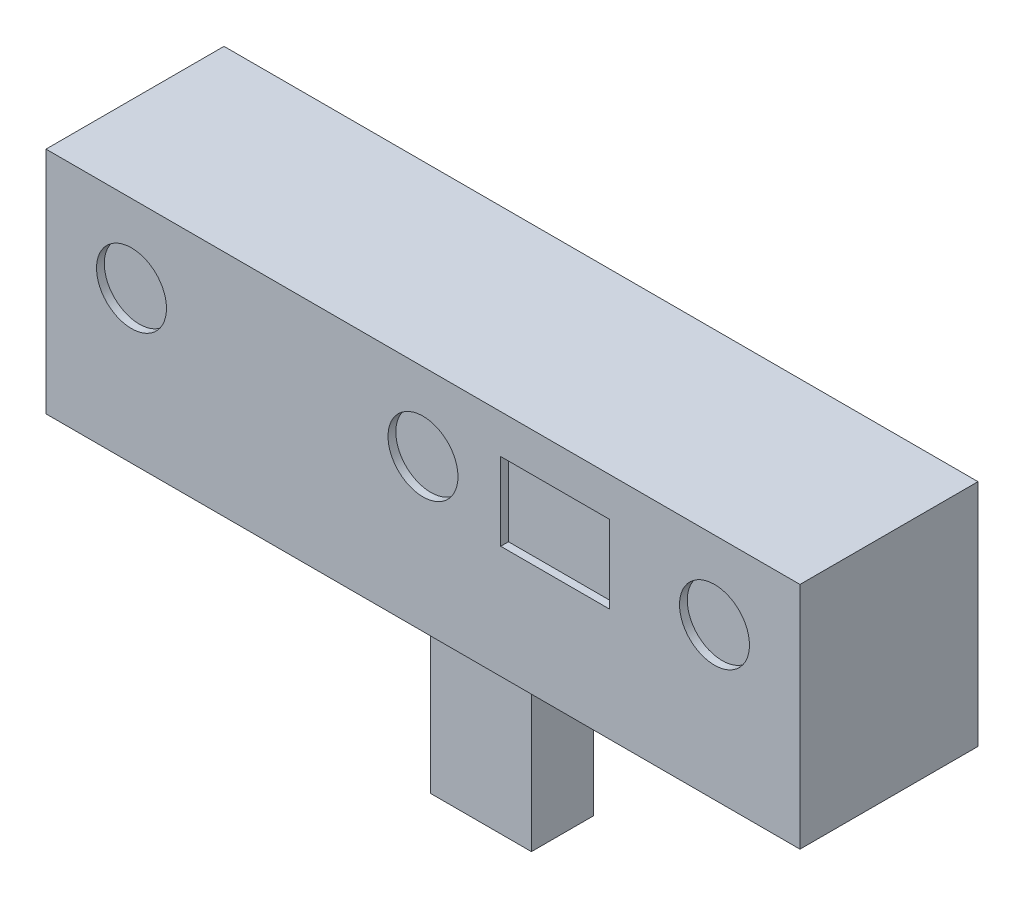
ISO-10303-21;
HEADER;
FILE_DESCRIPTION(('STEP AP214'),'2;1');
FILE_NAME('part.step','',(''),(''),'','','');
FILE_SCHEMA(('AUTOMOTIVE_DESIGN { 1 0 10303 214 1 1 1 1 }'));
ENDSEC;
DATA;
#1=APPLICATION_CONTEXT('core data for automotive mechanical design processes');
#2=APPLICATION_PROTOCOL_DEFINITION('international standard','automotive_design',2000,#1);
#3=PRODUCT_CONTEXT('',#1,'mechanical');
#4=PRODUCT('Part','Part','',(#3));
#5=PRODUCT_RELATED_PRODUCT_CATEGORY('part','',(#4));
#6=PRODUCT_DEFINITION_FORMATION('','',#4);
#7=PRODUCT_DEFINITION_CONTEXT('part definition',#1,'design');
#8=PRODUCT_DEFINITION('design','',#6,#7);
#9=PRODUCT_DEFINITION_SHAPE('','',#8);
#10=(LENGTH_UNIT() NAMED_UNIT(*) SI_UNIT(.MILLI.,.METRE.));
#11=(NAMED_UNIT(*) PLANE_ANGLE_UNIT() SI_UNIT($,.RADIAN.));
#12=(NAMED_UNIT(*) SI_UNIT($,.STERADIAN.) SOLID_ANGLE_UNIT());
#13=UNCERTAINTY_MEASURE_WITH_UNIT(LENGTH_MEASURE(1.E-05),#10,'distance_accuracy_value','');
#14=(GEOMETRIC_REPRESENTATION_CONTEXT(3) GLOBAL_UNCERTAINTY_ASSIGNED_CONTEXT((#13)) GLOBAL_UNIT_ASSIGNED_CONTEXT((#10,
#11,#12)) REPRESENTATION_CONTEXT('',''));
#15=CARTESIAN_POINT('',(0.,0.,0.));
#16=DIRECTION('',(0.,0.,1.));
#17=DIRECTION('',(1.,0.,0.));
#18=AXIS2_PLACEMENT_3D('',#15,#16,#17);
#19=CARTESIAN_POINT('',(-48.5,-19.5,22.9));
#20=DIRECTION('',(1.,0.,0.));
#21=DIRECTION('',(0.,0.,-1.));
#22=AXIS2_PLACEMENT_3D('',#19,#20,#21);
#23=PLANE('',#22);
#24=DIRECTION('',(0.,-1.,0.));
#25=VECTOR('',#24,1.);
#26=CARTESIAN_POINT('',(-48.5,-19.5,0.));
#27=LINE('',#26,#25);
#28=CARTESIAN_POINT('',(-48.5,10.,0.));
#29=VERTEX_POINT('',#28);
#30=CARTESIAN_POINT('',(-48.5,-19.5,0.));
#31=VERTEX_POINT('',#30);
#32=EDGE_CURVE('E220',#29,#31,#27,.T.);
#33=ORIENTED_EDGE('',*,*,#32,.T.);
#34=DIRECTION('',(0.,0.,-1.));
#35=VECTOR('',#34,1.);
#36=CARTESIAN_POINT('',(-48.5,-19.5,22.9));
#37=LINE('',#36,#35);
#38=CARTESIAN_POINT('',(-48.5,-19.5,22.9));
#39=VERTEX_POINT('',#38);
#40=EDGE_CURVE('E11',#39,#31,#37,.T.);
#41=ORIENTED_EDGE('',*,*,#40,.F.);
#42=DIRECTION('',(0.,-1.,0.));
#43=VECTOR('',#42,1.);
#44=CARTESIAN_POINT('',(-48.5,-19.5,22.9));
#45=LINE('',#44,#43);
#46=CARTESIAN_POINT('',(-48.5,10.,22.9));
#47=VERTEX_POINT('',#46);
#48=EDGE_CURVE('E228',#47,#39,#45,.T.);
#49=ORIENTED_EDGE('',*,*,#48,.F.);
#50=DIRECTION('',(0.,0.,-1.));
#51=VECTOR('',#50,1.);
#52=CARTESIAN_POINT('',(-48.5,10.,22.9));
#53=LINE('',#52,#51);
#54=EDGE_CURVE('E236',#47,#29,#53,.T.);
#55=ORIENTED_EDGE('',*,*,#54,.T.);
#56=EDGE_LOOP('',(#33,#41,#49,#55));
#57=FACE_BOUND('',#56,.T.);
#58=ADVANCED_FACE('F39',(#57),#23,.F.);
#59=CARTESIAN_POINT('',(-48.5,-19.5,22.9));
#60=DIRECTION('',(0.,1.,0.));
#61=DIRECTION('',(0.,0.,1.));
#62=AXIS2_PLACEMENT_3D('',#59,#60,#61);
#63=PLANE('',#62);
#64=DIRECTION('',(-1.,0.,0.));
#65=VECTOR('',#64,1.);
#66=CARTESIAN_POINT('',(-6.5,-19.5,7.45));
#67=LINE('',#66,#65);
#68=CARTESIAN_POINT('',(6.5,-19.5,7.45));
#69=VERTEX_POINT('',#68);
#70=CARTESIAN_POINT('',(-6.5,-19.5,7.45));
#71=VERTEX_POINT('',#70);
#72=EDGE_CURVE('E146',#69,#71,#67,.T.);
#73=ORIENTED_EDGE('',*,*,#72,.T.);
#74=DIRECTION('',(0.,0.,1.));
#75=VECTOR('',#74,1.);
#76=CARTESIAN_POINT('',(-6.5,-19.5,7.45));
#77=LINE('',#76,#75);
#78=CARTESIAN_POINT('',(-6.5,-19.5,15.45));
#79=VERTEX_POINT('',#78);
#80=EDGE_CURVE('E52',#71,#79,#77,.T.);
#81=ORIENTED_EDGE('',*,*,#80,.T.);
#82=DIRECTION('',(1.,0.,0.));
#83=VECTOR('',#82,1.);
#84=CARTESIAN_POINT('',(-6.5,-19.5,15.45));
#85=LINE('',#84,#83);
#86=CARTESIAN_POINT('',(6.5,-19.5,15.45));
#87=VERTEX_POINT('',#86);
#88=EDGE_CURVE('E135',#79,#87,#85,.T.);
#89=ORIENTED_EDGE('',*,*,#88,.T.);
#90=DIRECTION('',(0.,0.,-1.));
#91=VECTOR('',#90,1.);
#92=CARTESIAN_POINT('',(6.5,-19.5,7.45));
#93=LINE('',#92,#91);
#94=EDGE_CURVE('E155',#87,#69,#93,.T.);
#95=ORIENTED_EDGE('',*,*,#94,.T.);
#96=EDGE_LOOP('',(#73,#81,#89,#95));
#97=FACE_BOUND('',#96,.T.);
#98=DIRECTION('',(1.,0.,0.));
#99=VECTOR('',#98,1.);
#100=CARTESIAN_POINT('',(-48.5,-19.5,0.));
#101=LINE('',#100,#99);
#102=CARTESIAN_POINT('',(48.5,-19.5,0.));
#103=VERTEX_POINT('',#102);
#104=EDGE_CURVE('E237',#31,#103,#101,.T.);
#105=ORIENTED_EDGE('',*,*,#104,.T.);
#106=DIRECTION('',(0.,0.,-1.));
#107=VECTOR('',#106,1.);
#108=CARTESIAN_POINT('',(48.5,-19.5,22.9));
#109=LINE('',#108,#107);
#110=CARTESIAN_POINT('',(48.5,-19.5,22.9));
#111=VERTEX_POINT('',#110);
#112=EDGE_CURVE('E46',#111,#103,#109,.T.);
#113=ORIENTED_EDGE('',*,*,#112,.F.);
#114=DIRECTION('',(1.,0.,0.));
#115=VECTOR('',#114,1.);
#116=CARTESIAN_POINT('',(-48.5,-19.5,22.9));
#117=LINE('',#116,#115);
#118=EDGE_CURVE('E230',#39,#111,#117,.T.);
#119=ORIENTED_EDGE('',*,*,#118,.F.);
#120=ORIENTED_EDGE('',*,*,#40,.T.);
#121=EDGE_LOOP('',(#105,#113,#119,#120));
#122=FACE_BOUND('',#121,.T.);
#123=ADVANCED_FACE('F268',(#97,#122),#63,.F.);
#124=CARTESIAN_POINT('',(48.5,-19.5,22.9));
#125=DIRECTION('',(-1.,0.,0.));
#126=DIRECTION('',(0.,0.,1.));
#127=AXIS2_PLACEMENT_3D('',#124,#125,#126);
#128=PLANE('',#127);
#129=DIRECTION('',(0.,1.,0.));
#130=VECTOR('',#129,1.);
#131=CARTESIAN_POINT('',(48.5,-19.5,0.));
#132=LINE('',#131,#130);
#133=CARTESIAN_POINT('',(48.5,10.,0.));
#134=VERTEX_POINT('',#133);
#135=EDGE_CURVE('E241',#103,#134,#132,.T.);
#136=ORIENTED_EDGE('',*,*,#135,.T.);
#137=DIRECTION('',(0.,0.,-1.));
#138=VECTOR('',#137,1.);
#139=CARTESIAN_POINT('',(48.5,10.,22.9));
#140=LINE('',#139,#138);
#141=CARTESIAN_POINT('',(48.5,10.,22.9));
#142=VERTEX_POINT('',#141);
#143=EDGE_CURVE('E246',#142,#134,#140,.T.);
#144=ORIENTED_EDGE('',*,*,#143,.F.);
#145=DIRECTION('',(0.,1.,0.));
#146=VECTOR('',#145,1.);
#147=CARTESIAN_POINT('',(48.5,-19.5,22.9));
#148=LINE('',#147,#146);
#149=EDGE_CURVE('E235',#111,#142,#148,.T.);
#150=ORIENTED_EDGE('',*,*,#149,.F.);
#151=ORIENTED_EDGE('',*,*,#112,.T.);
#152=EDGE_LOOP('',(#136,#144,#150,#151));
#153=FACE_BOUND('',#152,.T.);
#154=ADVANCED_FACE('F254',(#153),#128,.F.);
#155=CARTESIAN_POINT('',(-48.5,10.,22.9));
#156=DIRECTION('',(0.,-1.,0.));
#157=DIRECTION('',(0.,0.,-1.));
#158=AXIS2_PLACEMENT_3D('',#155,#156,#157);
#159=PLANE('',#158);
#160=DIRECTION('',(-1.,0.,0.));
#161=VECTOR('',#160,1.);
#162=CARTESIAN_POINT('',(-48.5,10.,0.));
#163=LINE('',#162,#161);
#164=EDGE_CURVE('E229',#134,#29,#163,.T.);
#165=ORIENTED_EDGE('',*,*,#164,.T.);
#166=ORIENTED_EDGE('',*,*,#54,.F.);
#167=DIRECTION('',(-1.,0.,0.));
#168=VECTOR('',#167,1.);
#169=CARTESIAN_POINT('',(-48.5,10.,22.9));
#170=LINE('',#169,#168);
#171=EDGE_CURVE('E234',#142,#47,#170,.T.);
#172=ORIENTED_EDGE('',*,*,#171,.F.);
#173=ORIENTED_EDGE('',*,*,#143,.T.);
#174=EDGE_LOOP('',(#165,#166,#172,#173));
#175=FACE_BOUND('',#174,.T.);
#176=ADVANCED_FACE('F265',(#175),#159,.F.);
#177=CARTESIAN_POINT('',(0.,0.,22.9));
#178=DIRECTION('',(0.,0.,-1.));
#179=DIRECTION('',(-1.,0.,0.));
#180=AXIS2_PLACEMENT_3D('',#177,#178,#179);
#181=PLANE('',#180);
#182=CARTESIAN_POINT('',(37.5,0.,22.9));
#183=DIRECTION('',(0.,0.,1.));
#184=DIRECTION('',(1.,0.,0.));
#185=AXIS2_PLACEMENT_3D('',#182,#183,#184);
#186=CIRCLE('',#185,4.5);
#187=CARTESIAN_POINT('',(42.,0.,22.9));
#188=VERTEX_POINT('',#187);
#189=EDGE_CURVE('E167',#188,#188,#186,.T.);
#190=ORIENTED_EDGE('',*,*,#189,.F.);
#191=EDGE_LOOP('',(#190));
#192=FACE_BOUND('',#191,.T.);
#193=CARTESIAN_POINT('',(-37.5,0.,22.9));
#194=DIRECTION('',(0.,0.,1.));
#195=DIRECTION('',(1.,0.,0.));
#196=AXIS2_PLACEMENT_3D('',#193,#194,#195);
#197=CIRCLE('',#196,4.5);
#198=CARTESIAN_POINT('',(-33.,0.,22.9));
#199=VERTEX_POINT('',#198);
#200=EDGE_CURVE('E173',#199,#199,#197,.T.);
#201=ORIENTED_EDGE('',*,*,#200,.F.);
#202=EDGE_LOOP('',(#201));
#203=FACE_BOUND('',#202,.T.);
#204=CARTESIAN_POINT('',(0.,0.,22.9));
#205=DIRECTION('',(0.,0.,1.));
#206=DIRECTION('',(1.,0.,0.));
#207=AXIS2_PLACEMENT_3D('',#204,#205,#206);
#208=CIRCLE('',#207,4.5);
#209=CARTESIAN_POINT('',(4.5,0.,22.9));
#210=VERTEX_POINT('',#209);
#211=EDGE_CURVE('E177',#210,#210,#208,.T.);
#212=ORIENTED_EDGE('',*,*,#211,.F.);
#213=EDGE_LOOP('',(#212));
#214=FACE_BOUND('',#213,.T.);
#215=DIRECTION('',(1.,0.,0.));
#216=VECTOR('',#215,1.);
#217=CARTESIAN_POINT('',(10.,-5.,22.9));
#218=LINE('',#217,#216);
#219=CARTESIAN_POINT('',(10.,-5.,22.9));
#220=VERTEX_POINT('',#219);
#221=CARTESIAN_POINT('',(24.,-5.,22.9));
#222=VERTEX_POINT('',#221);
#223=EDGE_CURVE('E199',#220,#222,#218,.T.);
#224=ORIENTED_EDGE('',*,*,#223,.F.);
#225=DIRECTION('',(0.,-1.,0.));
#226=VECTOR('',#225,1.);
#227=CARTESIAN_POINT('',(10.,-5.,22.9));
#228=LINE('',#227,#226);
#229=CARTESIAN_POINT('',(10.,5.,22.9));
#230=VERTEX_POINT('',#229);
#231=EDGE_CURVE('E62',#230,#220,#228,.T.);
#232=ORIENTED_EDGE('',*,*,#231,.F.);
#233=DIRECTION('',(-1.,0.,0.));
#234=VECTOR('',#233,1.);
#235=CARTESIAN_POINT('',(10.,5.,22.9));
#236=LINE('',#235,#234);
#237=CARTESIAN_POINT('',(24.,5.,22.9));
#238=VERTEX_POINT('',#237);
#239=EDGE_CURVE('E194',#238,#230,#236,.T.);
#240=ORIENTED_EDGE('',*,*,#239,.F.);
#241=DIRECTION('',(0.,1.,0.));
#242=VECTOR('',#241,1.);
#243=CARTESIAN_POINT('',(24.,-5.,22.9));
#244=LINE('',#243,#242);
#245=EDGE_CURVE('E196',#222,#238,#244,.T.);
#246=ORIENTED_EDGE('',*,*,#245,.F.);
#247=EDGE_LOOP('',(#224,#232,#240,#246));
#248=FACE_BOUND('',#247,.T.);
#249=ORIENTED_EDGE('',*,*,#48,.T.);
#250=ORIENTED_EDGE('',*,*,#118,.T.);
#251=ORIENTED_EDGE('',*,*,#149,.T.);
#252=ORIENTED_EDGE('',*,*,#171,.T.);
#253=EDGE_LOOP('',(#249,#250,#251,#252));
#254=FACE_BOUND('',#253,.T.);
#255=ADVANCED_FACE('F269',(#192,#203,#214,#248,#254),#181,.F.);
#256=CARTESIAN_POINT('',(0.,0.,0.));
#257=DIRECTION('',(0.,0.,-1.));
#258=DIRECTION('',(-1.,0.,0.));
#259=AXIS2_PLACEMENT_3D('',#256,#257,#258);
#260=PLANE('',#259);
#261=CARTESIAN_POINT('',(37.5,-4.75,0.));
#262=DIRECTION('',(0.,0.,1.));
#263=DIRECTION('',(1.,0.,0.));
#264=AXIS2_PLACEMENT_3D('',#261,#262,#263);
#265=CIRCLE('',#264,1.65);
#266=CARTESIAN_POINT('',(39.15,-4.75,0.));
#267=VERTEX_POINT('',#266);
#268=EDGE_CURVE('E217',#267,#267,#265,.T.);
#269=ORIENTED_EDGE('',*,*,#268,.T.);
#270=EDGE_LOOP('',(#269));
#271=FACE_BOUND('',#270,.T.);
#272=CARTESIAN_POINT('',(-37.5,-4.75,0.));
#273=DIRECTION('',(0.,0.,1.));
#274=DIRECTION('',(1.,0.,0.));
#275=AXIS2_PLACEMENT_3D('',#272,#273,#274);
#276=CIRCLE('',#275,1.65);
#277=CARTESIAN_POINT('',(-35.85,-4.75,0.));
#278=VERTEX_POINT('',#277);
#279=EDGE_CURVE('E221',#278,#278,#276,.T.);
#280=ORIENTED_EDGE('',*,*,#279,.T.);
#281=EDGE_LOOP('',(#280));
#282=FACE_BOUND('',#281,.T.);
#283=ORIENTED_EDGE('',*,*,#32,.F.);
#284=ORIENTED_EDGE('',*,*,#164,.F.);
#285=ORIENTED_EDGE('',*,*,#135,.F.);
#286=ORIENTED_EDGE('',*,*,#104,.F.);
#287=EDGE_LOOP('',(#283,#284,#285,#286));
#288=FACE_BOUND('',#287,.T.);
#289=ADVANCED_FACE('F256',(#271,#282,#288),#260,.T.);
#290=CARTESIAN_POINT('',(-37.5,-4.75,8.));
#291=DIRECTION('',(0.,0.,-1.));
#292=DIRECTION('',(-1.,0.,0.));
#293=AXIS2_PLACEMENT_3D('',#290,#291,#292);
#294=CYLINDRICAL_SURFACE('',#293,1.65);
#295=CARTESIAN_POINT('',(-37.5,-4.75,8.));
#296=DIRECTION('',(0.,0.,1.));
#297=DIRECTION('',(1.,0.,0.));
#298=AXIS2_PLACEMENT_3D('',#295,#296,#297);
#299=CIRCLE('',#298,1.65);
#300=CARTESIAN_POINT('',(-35.85,-4.75,8.));
#301=VERTEX_POINT('',#300);
#302=EDGE_CURVE('E169',#301,#301,#299,.T.);
#303=ORIENTED_EDGE('',*,*,#302,.T.);
#304=EDGE_LOOP('',(#303));
#305=FACE_BOUND('',#304,.T.);
#306=ORIENTED_EDGE('',*,*,#279,.F.);
#307=EDGE_LOOP('',(#306));
#308=FACE_BOUND('',#307,.T.);
#309=ADVANCED_FACE('F283',(#305,#308),#294,.F.);
#310=CARTESIAN_POINT('',(-37.5,-4.75,8.));
#311=DIRECTION('',(0.,0.,1.));
#312=DIRECTION('',(1.,0.,0.));
#313=AXIS2_PLACEMENT_3D('',#310,#311,#312);
#314=PLANE('',#313);
#315=ORIENTED_EDGE('',*,*,#302,.F.);
#316=EDGE_LOOP('',(#315));
#317=FACE_BOUND('',#316,.T.);
#318=ADVANCED_FACE('F288',(#317),#314,.F.);
#319=CARTESIAN_POINT('',(37.5,-4.75,8.));
#320=DIRECTION('',(0.,0.,-1.));
#321=DIRECTION('',(-1.,0.,0.));
#322=AXIS2_PLACEMENT_3D('',#319,#320,#321);
#323=CYLINDRICAL_SURFACE('',#322,1.65);
#324=CARTESIAN_POINT('',(37.5,-4.75,8.));
#325=DIRECTION('',(0.,0.,1.));
#326=DIRECTION('',(1.,0.,0.));
#327=AXIS2_PLACEMENT_3D('',#324,#325,#326);
#328=CIRCLE('',#327,1.65);
#329=CARTESIAN_POINT('',(39.15,-4.75,8.));
#330=VERTEX_POINT('',#329);
#331=EDGE_CURVE('E211',#330,#330,#328,.T.);
#332=ORIENTED_EDGE('',*,*,#331,.T.);
#333=EDGE_LOOP('',(#332));
#334=FACE_BOUND('',#333,.T.);
#335=ORIENTED_EDGE('',*,*,#268,.F.);
#336=EDGE_LOOP('',(#335));
#337=FACE_BOUND('',#336,.T.);
#338=ADVANCED_FACE('F292',(#334,#337),#323,.F.);
#339=CARTESIAN_POINT('',(37.5,-4.75,8.));
#340=DIRECTION('',(0.,0.,1.));
#341=DIRECTION('',(1.,0.,0.));
#342=AXIS2_PLACEMENT_3D('',#339,#340,#341);
#343=PLANE('',#342);
#344=ORIENTED_EDGE('',*,*,#331,.F.);
#345=EDGE_LOOP('',(#344));
#346=FACE_BOUND('',#345,.T.);
#347=ADVANCED_FACE('F299',(#346),#343,.F.);
#348=CARTESIAN_POINT('',(10.,-5.,21.9));
#349=DIRECTION('',(-1.,0.,0.));
#350=DIRECTION('',(0.,0.,1.));
#351=AXIS2_PLACEMENT_3D('',#348,#349,#350);
#352=PLANE('',#351);
#353=ORIENTED_EDGE('',*,*,#231,.T.);
#354=DIRECTION('',(0.,0.,1.));
#355=VECTOR('',#354,1.);
#356=CARTESIAN_POINT('',(10.,-5.,21.9));
#357=LINE('',#356,#355);
#358=CARTESIAN_POINT('',(10.,-5.,21.9));
#359=VERTEX_POINT('',#358);
#360=EDGE_CURVE('E184',#359,#220,#357,.T.);
#361=ORIENTED_EDGE('',*,*,#360,.F.);
#362=DIRECTION('',(0.,-1.,0.));
#363=VECTOR('',#362,1.);
#364=CARTESIAN_POINT('',(10.,-5.,21.9));
#365=LINE('',#364,#363);
#366=CARTESIAN_POINT('',(10.,5.,21.9));
#367=VERTEX_POINT('',#366);
#368=EDGE_CURVE('E200',#367,#359,#365,.T.);
#369=ORIENTED_EDGE('',*,*,#368,.F.);
#370=DIRECTION('',(0.,0.,1.));
#371=VECTOR('',#370,1.);
#372=CARTESIAN_POINT('',(10.,5.,21.9));
#373=LINE('',#372,#371);
#374=EDGE_CURVE('E162',#367,#230,#373,.T.);
#375=ORIENTED_EDGE('',*,*,#374,.T.);
#376=EDGE_LOOP('',(#353,#361,#369,#375));
#377=FACE_BOUND('',#376,.T.);
#378=ADVANCED_FACE('F303',(#377),#352,.F.);
#379=CARTESIAN_POINT('',(10.,5.,21.9));
#380=DIRECTION('',(0.,1.,0.));
#381=DIRECTION('',(0.,0.,1.));
#382=AXIS2_PLACEMENT_3D('',#379,#380,#381);
#383=PLANE('',#382);
#384=ORIENTED_EDGE('',*,*,#239,.T.);
#385=ORIENTED_EDGE('',*,*,#374,.F.);
#386=DIRECTION('',(-1.,0.,0.));
#387=VECTOR('',#386,1.);
#388=CARTESIAN_POINT('',(10.,5.,21.9));
#389=LINE('',#388,#387);
#390=CARTESIAN_POINT('',(24.,5.,21.9));
#391=VERTEX_POINT('',#390);
#392=EDGE_CURVE('E190',#391,#367,#389,.T.);
#393=ORIENTED_EDGE('',*,*,#392,.F.);
#394=DIRECTION('',(0.,0.,1.));
#395=VECTOR('',#394,1.);
#396=CARTESIAN_POINT('',(24.,5.,21.9));
#397=LINE('',#396,#395);
#398=EDGE_CURVE('E188',#391,#238,#397,.T.);
#399=ORIENTED_EDGE('',*,*,#398,.T.);
#400=EDGE_LOOP('',(#384,#385,#393,#399));
#401=FACE_BOUND('',#400,.T.);
#402=ADVANCED_FACE('F311',(#401),#383,.F.);
#403=CARTESIAN_POINT('',(24.,-5.,21.9));
#404=DIRECTION('',(1.,0.,0.));
#405=DIRECTION('',(0.,0.,-1.));
#406=AXIS2_PLACEMENT_3D('',#403,#404,#405);
#407=PLANE('',#406);
#408=ORIENTED_EDGE('',*,*,#245,.T.);
#409=ORIENTED_EDGE('',*,*,#398,.F.);
#410=DIRECTION('',(0.,1.,0.));
#411=VECTOR('',#410,1.);
#412=CARTESIAN_POINT('',(24.,-5.,21.9));
#413=LINE('',#412,#411);
#414=CARTESIAN_POINT('',(24.,-5.,21.9));
#415=VERTEX_POINT('',#414);
#416=EDGE_CURVE('E207',#415,#391,#413,.T.);
#417=ORIENTED_EDGE('',*,*,#416,.F.);
#418=DIRECTION('',(0.,0.,1.));
#419=VECTOR('',#418,1.);
#420=CARTESIAN_POINT('',(24.,-5.,21.9));
#421=LINE('',#420,#419);
#422=EDGE_CURVE('E189',#415,#222,#421,.T.);
#423=ORIENTED_EDGE('',*,*,#422,.T.);
#424=EDGE_LOOP('',(#408,#409,#417,#423));
#425=FACE_BOUND('',#424,.T.);
#426=ADVANCED_FACE('F313',(#425),#407,.F.);
#427=CARTESIAN_POINT('',(10.,-5.,21.9));
#428=DIRECTION('',(0.,-1.,0.));
#429=DIRECTION('',(0.,0.,-1.));
#430=AXIS2_PLACEMENT_3D('',#427,#428,#429);
#431=PLANE('',#430);
#432=ORIENTED_EDGE('',*,*,#223,.T.);
#433=ORIENTED_EDGE('',*,*,#422,.F.);
#434=DIRECTION('',(1.,0.,0.));
#435=VECTOR('',#434,1.);
#436=CARTESIAN_POINT('',(10.,-5.,21.9));
#437=LINE('',#436,#435);
#438=EDGE_CURVE('E209',#359,#415,#437,.T.);
#439=ORIENTED_EDGE('',*,*,#438,.F.);
#440=ORIENTED_EDGE('',*,*,#360,.T.);
#441=EDGE_LOOP('',(#432,#433,#439,#440));
#442=FACE_BOUND('',#441,.T.);
#443=ADVANCED_FACE('F307',(#442),#431,.F.);
#444=CARTESIAN_POINT('',(0.,0.,21.9));
#445=DIRECTION('',(0.,0.,-1.));
#446=DIRECTION('',(-1.,0.,0.));
#447=AXIS2_PLACEMENT_3D('',#444,#445,#446);
#448=PLANE('',#447);
#449=ORIENTED_EDGE('',*,*,#368,.T.);
#450=ORIENTED_EDGE('',*,*,#438,.T.);
#451=ORIENTED_EDGE('',*,*,#416,.T.);
#452=ORIENTED_EDGE('',*,*,#392,.T.);
#453=EDGE_LOOP('',(#449,#450,#451,#452));
#454=FACE_BOUND('',#453,.T.);
#455=ADVANCED_FACE('F304',(#454),#448,.F.);
#456=CARTESIAN_POINT('',(0.,0.,21.9));
#457=DIRECTION('',(0.,0.,1.));
#458=DIRECTION('',(1.,0.,0.));
#459=AXIS2_PLACEMENT_3D('',#456,#457,#458);
#460=CYLINDRICAL_SURFACE('',#459,4.5);
#461=CARTESIAN_POINT('',(0.,0.,21.9));
#462=DIRECTION('',(0.,0.,1.));
#463=DIRECTION('',(1.,0.,0.));
#464=AXIS2_PLACEMENT_3D('',#461,#462,#463);
#465=CIRCLE('',#464,4.5);
#466=CARTESIAN_POINT('',(4.5,0.,21.9));
#467=VERTEX_POINT('',#466);
#468=EDGE_CURVE('E185',#467,#467,#465,.T.);
#469=ORIENTED_EDGE('',*,*,#468,.F.);
#470=EDGE_LOOP('',(#469));
#471=FACE_BOUND('',#470,.T.);
#472=ORIENTED_EDGE('',*,*,#211,.T.);
#473=EDGE_LOOP('',(#472));
#474=FACE_BOUND('',#473,.T.);
#475=ADVANCED_FACE('F308',(#471,#474),#460,.F.);
#476=CARTESIAN_POINT('',(0.,0.,21.9));
#477=DIRECTION('',(0.,0.,1.));
#478=DIRECTION('',(1.,0.,0.));
#479=AXIS2_PLACEMENT_3D('',#476,#477,#478);
#480=PLANE('',#479);
#481=ORIENTED_EDGE('',*,*,#468,.T.);
#482=EDGE_LOOP('',(#481));
#483=FACE_BOUND('',#482,.T.);
#484=ADVANCED_FACE('F321',(#483),#480,.T.);
#485=CARTESIAN_POINT('',(-37.5,0.,21.9));
#486=DIRECTION('',(0.,0.,1.));
#487=DIRECTION('',(1.,0.,0.));
#488=AXIS2_PLACEMENT_3D('',#485,#486,#487);
#489=CYLINDRICAL_SURFACE('',#488,4.5);
#490=CARTESIAN_POINT('',(-37.5,0.,21.9));
#491=DIRECTION('',(0.,0.,1.));
#492=DIRECTION('',(1.,0.,0.));
#493=AXIS2_PLACEMENT_3D('',#490,#491,#492);
#494=CIRCLE('',#493,4.5);
#495=CARTESIAN_POINT('',(-33.,0.,21.9));
#496=VERTEX_POINT('',#495);
#497=EDGE_CURVE('E176',#496,#496,#494,.T.);
#498=ORIENTED_EDGE('',*,*,#497,.F.);
#499=EDGE_LOOP('',(#498));
#500=FACE_BOUND('',#499,.T.);
#501=ORIENTED_EDGE('',*,*,#200,.T.);
#502=EDGE_LOOP('',(#501));
#503=FACE_BOUND('',#502,.T.);
#504=ADVANCED_FACE('F330',(#500,#503),#489,.F.);
#505=CARTESIAN_POINT('',(-37.5,0.,21.9));
#506=DIRECTION('',(0.,0.,1.));
#507=DIRECTION('',(1.,0.,0.));
#508=AXIS2_PLACEMENT_3D('',#505,#506,#507);
#509=PLANE('',#508);
#510=ORIENTED_EDGE('',*,*,#497,.T.);
#511=EDGE_LOOP('',(#510));
#512=FACE_BOUND('',#511,.T.);
#513=ADVANCED_FACE('F332',(#512),#509,.T.);
#514=CARTESIAN_POINT('',(37.5,0.,21.9));
#515=DIRECTION('',(0.,0.,1.));
#516=DIRECTION('',(1.,0.,0.));
#517=AXIS2_PLACEMENT_3D('',#514,#515,#516);
#518=CYLINDRICAL_SURFACE('',#517,4.5);
#519=CARTESIAN_POINT('',(37.5,0.,21.9));
#520=DIRECTION('',(0.,0.,1.));
#521=DIRECTION('',(1.,0.,0.));
#522=AXIS2_PLACEMENT_3D('',#519,#520,#521);
#523=CIRCLE('',#522,4.5);
#524=CARTESIAN_POINT('',(42.,0.,21.9));
#525=VERTEX_POINT('',#524);
#526=EDGE_CURVE('E168',#525,#525,#523,.T.);
#527=ORIENTED_EDGE('',*,*,#526,.F.);
#528=EDGE_LOOP('',(#527));
#529=FACE_BOUND('',#528,.T.);
#530=ORIENTED_EDGE('',*,*,#189,.T.);
#531=EDGE_LOOP('',(#530));
#532=FACE_BOUND('',#531,.T.);
#533=ADVANCED_FACE('F335',(#529,#532),#518,.F.);
#534=CARTESIAN_POINT('',(37.5,0.,21.9));
#535=DIRECTION('',(0.,0.,1.));
#536=DIRECTION('',(1.,0.,0.));
#537=AXIS2_PLACEMENT_3D('',#534,#535,#536);
#538=PLANE('',#537);
#539=ORIENTED_EDGE('',*,*,#526,.T.);
#540=EDGE_LOOP('',(#539));
#541=FACE_BOUND('',#540,.T.);
#542=ADVANCED_FACE('F345',(#541),#538,.T.);
#543=CARTESIAN_POINT('',(-6.5,-44.5,7.45));
#544=DIRECTION('',(-1.,0.,0.));
#545=DIRECTION('',(0.,0.,1.));
#546=AXIS2_PLACEMENT_3D('',#543,#544,#545);
#547=PLANE('',#546);
#548=ORIENTED_EDGE('',*,*,#80,.F.);
#549=DIRECTION('',(0.,1.,0.));
#550=VECTOR('',#549,1.);
#551=CARTESIAN_POINT('',(-6.5,-44.5,7.45));
#552=LINE('',#551,#550);
#553=CARTESIAN_POINT('',(-6.5,-44.5,7.45));
#554=VERTEX_POINT('',#553);
#555=EDGE_CURVE('E149',#554,#71,#552,.T.);
#556=ORIENTED_EDGE('',*,*,#555,.F.);
#557=DIRECTION('',(0.,0.,1.));
#558=VECTOR('',#557,1.);
#559=CARTESIAN_POINT('',(-6.5,-44.5,7.45));
#560=LINE('',#559,#558);
#561=CARTESIAN_POINT('',(-6.5,-44.5,15.45));
#562=VERTEX_POINT('',#561);
#563=EDGE_CURVE('E145',#554,#562,#560,.T.);
#564=ORIENTED_EDGE('',*,*,#563,.T.);
#565=DIRECTION('',(0.,1.,0.));
#566=VECTOR('',#565,1.);
#567=CARTESIAN_POINT('',(-6.5,-44.5,15.45));
#568=LINE('',#567,#566);
#569=EDGE_CURVE('E130',#562,#79,#568,.T.);
#570=ORIENTED_EDGE('',*,*,#569,.T.);
#571=EDGE_LOOP('',(#548,#556,#564,#570));
#572=FACE_BOUND('',#571,.T.);
#573=ADVANCED_FACE('F150',(#572),#547,.T.);
#574=CARTESIAN_POINT('',(-6.5,-44.5,7.45));
#575=DIRECTION('',(0.,0.,-1.));
#576=DIRECTION('',(-1.,0.,0.));
#577=AXIS2_PLACEMENT_3D('',#574,#575,#576);
#578=PLANE('',#577);
#579=ORIENTED_EDGE('',*,*,#72,.F.);
#580=DIRECTION('',(0.,1.,0.));
#581=VECTOR('',#580,1.);
#582=CARTESIAN_POINT('',(6.5,-44.5,7.45));
#583=LINE('',#582,#581);
#584=CARTESIAN_POINT('',(6.5,-44.5,7.45));
#585=VERTEX_POINT('',#584);
#586=EDGE_CURVE('E161',#585,#69,#583,.T.);
#587=ORIENTED_EDGE('',*,*,#586,.F.);
#588=DIRECTION('',(-1.,0.,0.));
#589=VECTOR('',#588,1.);
#590=CARTESIAN_POINT('',(-6.5,-44.5,7.45));
#591=LINE('',#590,#589);
#592=EDGE_CURVE('E134',#585,#554,#591,.T.);
#593=ORIENTED_EDGE('',*,*,#592,.T.);
#594=ORIENTED_EDGE('',*,*,#555,.T.);
#595=EDGE_LOOP('',(#579,#587,#593,#594));
#596=FACE_BOUND('',#595,.T.);
#597=ADVANCED_FACE('F350',(#596),#578,.T.);
#598=CARTESIAN_POINT('',(6.5,-44.5,7.45));
#599=DIRECTION('',(1.,0.,0.));
#600=DIRECTION('',(0.,0.,-1.));
#601=AXIS2_PLACEMENT_3D('',#598,#599,#600);
#602=PLANE('',#601);
#603=ORIENTED_EDGE('',*,*,#94,.F.);
#604=DIRECTION('',(0.,1.,0.));
#605=VECTOR('',#604,1.);
#606=CARTESIAN_POINT('',(6.5,-44.5,15.45));
#607=LINE('',#606,#605);
#608=CARTESIAN_POINT('',(6.5,-44.5,15.45));
#609=VERTEX_POINT('',#608);
#610=EDGE_CURVE('E133',#609,#87,#607,.T.);
#611=ORIENTED_EDGE('',*,*,#610,.F.);
#612=DIRECTION('',(0.,0.,-1.));
#613=VECTOR('',#612,1.);
#614=CARTESIAN_POINT('',(6.5,-44.5,7.45));
#615=LINE('',#614,#613);
#616=EDGE_CURVE('E143',#609,#585,#615,.T.);
#617=ORIENTED_EDGE('',*,*,#616,.T.);
#618=ORIENTED_EDGE('',*,*,#586,.T.);
#619=EDGE_LOOP('',(#603,#611,#617,#618));
#620=FACE_BOUND('',#619,.T.);
#621=ADVANCED_FACE('F349',(#620),#602,.T.);
#622=CARTESIAN_POINT('',(-6.5,-44.5,15.45));
#623=DIRECTION('',(0.,0.,1.));
#624=DIRECTION('',(1.,0.,0.));
#625=AXIS2_PLACEMENT_3D('',#622,#623,#624);
#626=PLANE('',#625);
#627=ORIENTED_EDGE('',*,*,#88,.F.);
#628=ORIENTED_EDGE('',*,*,#569,.F.);
#629=DIRECTION('',(1.,0.,0.));
#630=VECTOR('',#629,1.);
#631=CARTESIAN_POINT('',(-6.5,-44.5,15.45));
#632=LINE('',#631,#630);
#633=EDGE_CURVE('E128',#562,#609,#632,.T.);
#634=ORIENTED_EDGE('',*,*,#633,.T.);
#635=ORIENTED_EDGE('',*,*,#610,.T.);
#636=EDGE_LOOP('',(#627,#628,#634,#635));
#637=FACE_BOUND('',#636,.T.);
#638=ADVANCED_FACE('F126',(#637),#626,.T.);
#639=CARTESIAN_POINT('',(0.,-44.5,0.));
#640=DIRECTION('',(0.,1.,0.));
#641=DIRECTION('',(0.,0.,1.));
#642=AXIS2_PLACEMENT_3D('',#639,#640,#641);
#643=PLANE('',#642);
#644=ORIENTED_EDGE('',*,*,#563,.F.);
#645=ORIENTED_EDGE('',*,*,#592,.F.);
#646=ORIENTED_EDGE('',*,*,#616,.F.);
#647=ORIENTED_EDGE('',*,*,#633,.F.);
#648=EDGE_LOOP('',(#644,#645,#646,#647));
#649=FACE_BOUND('',#648,.T.);
#650=ADVANCED_FACE('F140',(#649),#643,.F.);
#651=CLOSED_SHELL('',(#58,#123,#154,#176,#255,#289,#309,#318,#338,#347,#378,#402,#426,#443,#455,
#475,#484,#504,#513,#533,#542,#573,#597,#621,#638,#650));
#652=MANIFOLD_SOLID_BREP('B2',#651);
#653=ADVANCED_BREP_SHAPE_REPRESENTATION('',(#18,#652),#14);
#654=SHAPE_DEFINITION_REPRESENTATION(#9,#653);
ENDSEC;
END-ISO-10303-21;
